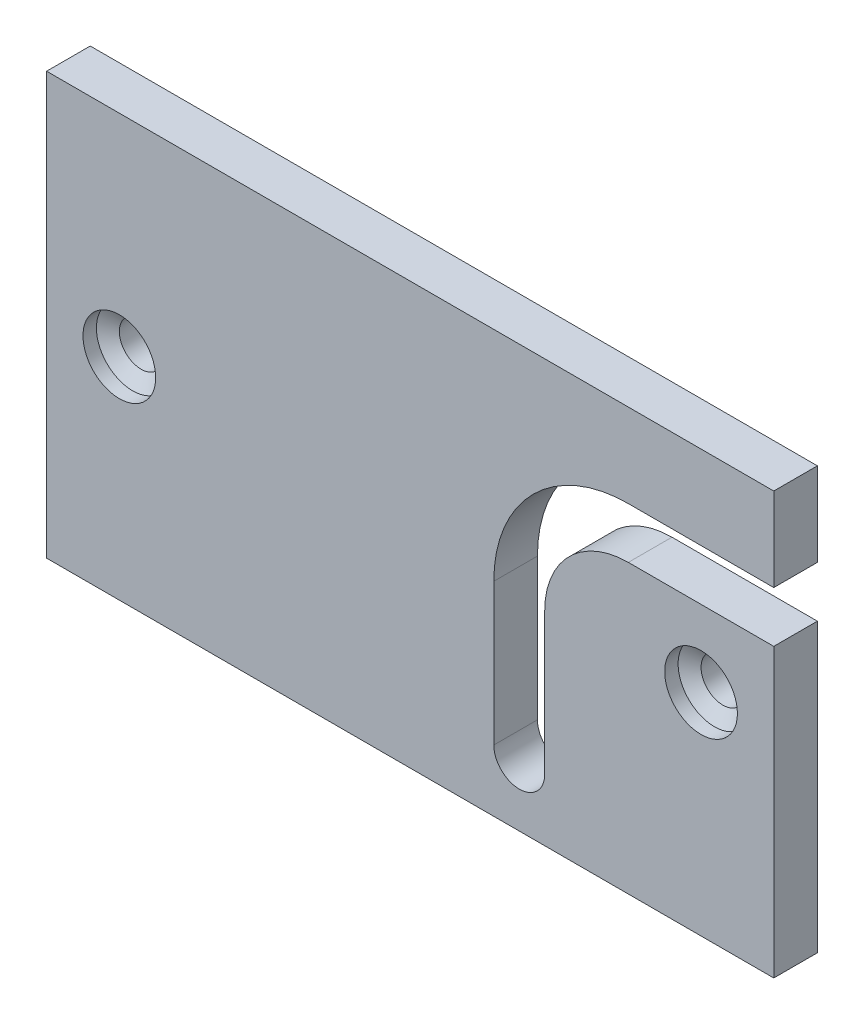
ISO-10303-21;
HEADER;
FILE_DESCRIPTION(('STEP AP214'),'2;1');
FILE_NAME('part.step','',(''),(''),'','','');
FILE_SCHEMA(('AUTOMOTIVE_DESIGN { 1 0 10303 214 1 1 1 1 }'));
ENDSEC;
DATA;
#1=APPLICATION_CONTEXT('core data for automotive mechanical design processes');
#2=APPLICATION_PROTOCOL_DEFINITION('international standard','automotive_design',2000,#1);
#3=PRODUCT_CONTEXT('',#1,'mechanical');
#4=PRODUCT('Part','Part','',(#3));
#5=PRODUCT_RELATED_PRODUCT_CATEGORY('part','',(#4));
#6=PRODUCT_DEFINITION_FORMATION('','',#4);
#7=PRODUCT_DEFINITION_CONTEXT('part definition',#1,'design');
#8=PRODUCT_DEFINITION('design','',#6,#7);
#9=PRODUCT_DEFINITION_SHAPE('','',#8);
#10=(LENGTH_UNIT() NAMED_UNIT(*) SI_UNIT(.MILLI.,.METRE.));
#11=(NAMED_UNIT(*) PLANE_ANGLE_UNIT() SI_UNIT($,.RADIAN.));
#12=(NAMED_UNIT(*) SI_UNIT($,.STERADIAN.) SOLID_ANGLE_UNIT());
#13=UNCERTAINTY_MEASURE_WITH_UNIT(LENGTH_MEASURE(1.E-05),#10,'distance_accuracy_value','');
#14=(GEOMETRIC_REPRESENTATION_CONTEXT(3) GLOBAL_UNCERTAINTY_ASSIGNED_CONTEXT((#13)) GLOBAL_UNIT_ASSIGNED_CONTEXT((#10,
#11,#12)) REPRESENTATION_CONTEXT('',''));
#15=CARTESIAN_POINT('',(0.,0.,0.));
#16=DIRECTION('',(0.,0.,1.));
#17=DIRECTION('',(1.,0.,0.));
#18=AXIS2_PLACEMENT_3D('',#15,#16,#17);
#19=CARTESIAN_POINT('',(50.,-29.,3.));
#20=DIRECTION('',(-1.,0.,0.));
#21=DIRECTION('',(0.,0.,1.));
#22=AXIS2_PLACEMENT_3D('',#19,#20,#21);
#23=PLANE('',#22);
#24=DIRECTION('',(0.,0.,1.));
#25=VECTOR('',#24,1.);
#26=CARTESIAN_POINT('',(50.,17.5,-3.));
#27=LINE('',#26,#25);
#28=CARTESIAN_POINT('',(50.,17.5,-3.));
#29=VERTEX_POINT('',#28);
#30=CARTESIAN_POINT('',(50.,17.5,3.));
#31=VERTEX_POINT('',#30);
#32=EDGE_CURVE('E219',#29,#31,#27,.T.);
#33=ORIENTED_EDGE('',*,*,#32,.F.);
#34=DIRECTION('',(0.,1.,0.));
#35=VECTOR('',#34,1.);
#36=CARTESIAN_POINT('',(50.,-29.,-3.));
#37=LINE('',#36,#35);
#38=CARTESIAN_POINT('',(50.,29.,-3.));
#39=VERTEX_POINT('',#38);
#40=EDGE_CURVE('E266',#29,#39,#37,.T.);
#41=ORIENTED_EDGE('',*,*,#40,.T.);
#42=DIRECTION('',(0.,0.,-1.));
#43=VECTOR('',#42,1.);
#44=CARTESIAN_POINT('',(50.,29.,3.));
#45=LINE('',#44,#43);
#46=CARTESIAN_POINT('',(50.,29.,3.));
#47=VERTEX_POINT('',#46);
#48=EDGE_CURVE('E275',#47,#39,#45,.T.);
#49=ORIENTED_EDGE('',*,*,#48,.F.);
#50=DIRECTION('',(0.,1.,0.));
#51=VECTOR('',#50,1.);
#52=CARTESIAN_POINT('',(50.,-29.,3.));
#53=LINE('',#52,#51);
#54=EDGE_CURVE('E252',#31,#47,#53,.T.);
#55=ORIENTED_EDGE('',*,*,#54,.F.);
#56=EDGE_LOOP('',(#33,#41,#49,#55));
#57=FACE_BOUND('',#56,.T.);
#58=ADVANCED_FACE('F42',(#57),#23,.F.);
#59=CARTESIAN_POINT('',(0.,0.,3.));
#60=DIRECTION('',(0.,0.,-1.));
#61=DIRECTION('',(-1.,0.,0.));
#62=AXIS2_PLACEMENT_3D('',#59,#60,#61);
#63=PLANE('',#62);
#64=CARTESIAN_POINT('',(40.,0.,3.));
#65=DIRECTION('',(0.,0.,1.));
#66=DIRECTION('',(1.,0.,0.));
#67=AXIS2_PLACEMENT_3D('',#64,#65,#66);
#68=CIRCLE('',#67,5.);
#69=CARTESIAN_POINT('',(45.,0.,3.));
#70=VERTEX_POINT('',#69);
#71=EDGE_CURVE('E212',#70,#70,#68,.T.);
#72=ORIENTED_EDGE('',*,*,#71,.F.);
#73=EDGE_LOOP('',(#72));
#74=FACE_BOUND('',#73,.T.);
#75=CARTESIAN_POINT('',(-40.,0.,3.));
#76=DIRECTION('',(0.,0.,1.));
#77=DIRECTION('',(1.,0.,0.));
#78=AXIS2_PLACEMENT_3D('',#75,#76,#77);
#79=CIRCLE('',#78,5.);
#80=CARTESIAN_POINT('',(-35.,0.,3.));
#81=VERTEX_POINT('',#80);
#82=EDGE_CURVE('E231',#81,#81,#79,.T.);
#83=ORIENTED_EDGE('',*,*,#82,.F.);
#84=EDGE_LOOP('',(#83));
#85=FACE_BOUND('',#84,.T.);
#86=DIRECTION('',(1.,0.,0.));
#87=VECTOR('',#86,1.);
#88=CARTESIAN_POINT('',(0.,17.5,3.));
#89=LINE('',#88,#87);
#90=CARTESIAN_POINT('',(30.,17.5,3.));
#91=VERTEX_POINT('',#90);
#92=EDGE_CURVE('E202',#91,#31,#89,.T.);
#93=ORIENTED_EDGE('',*,*,#92,.T.);
#94=ORIENTED_EDGE('',*,*,#54,.T.);
#95=DIRECTION('',(-1.,0.,0.));
#96=VECTOR('',#95,1.);
#97=CARTESIAN_POINT('',(-50.,29.,3.));
#98=LINE('',#97,#96);
#99=CARTESIAN_POINT('',(-50.,29.,3.));
#100=VERTEX_POINT('',#99);
#101=EDGE_CURVE('E68',#47,#100,#98,.T.);
#102=ORIENTED_EDGE('',*,*,#101,.T.);
#103=DIRECTION('',(0.,-1.,0.));
#104=VECTOR('',#103,1.);
#105=CARTESIAN_POINT('',(-50.,-29.,3.));
#106=LINE('',#105,#104);
#107=CARTESIAN_POINT('',(-50.,-29.,3.));
#108=VERTEX_POINT('',#107);
#109=EDGE_CURVE('E247',#100,#108,#106,.T.);
#110=ORIENTED_EDGE('',*,*,#109,.T.);
#111=DIRECTION('',(1.,0.,0.));
#112=VECTOR('',#111,1.);
#113=CARTESIAN_POINT('',(-50.,-29.,3.));
#114=LINE('',#113,#112);
#115=CARTESIAN_POINT('',(50.,-29.,3.));
#116=VERTEX_POINT('',#115);
#117=EDGE_CURVE('E97',#108,#116,#114,.T.);
#118=ORIENTED_EDGE('',*,*,#117,.T.);
#119=CARTESIAN_POINT('',(50.,10.5,3.));
#120=VERTEX_POINT('',#119);
#121=EDGE_CURVE('E253',#116,#120,#53,.T.);
#122=ORIENTED_EDGE('',*,*,#121,.T.);
#123=DIRECTION('',(1.,0.,0.));
#124=VECTOR('',#123,1.);
#125=CARTESIAN_POINT('',(0.,10.5,3.));
#126=LINE('',#125,#124);
#127=CARTESIAN_POINT('',(30.,10.5,3.));
#128=VERTEX_POINT('',#127);
#129=EDGE_CURVE('E199',#128,#120,#126,.T.);
#130=ORIENTED_EDGE('',*,*,#129,.F.);
#131=CARTESIAN_POINT('',(30.,-1.00000000000001,3.));
#132=DIRECTION('',(0.,0.,1.));
#133=DIRECTION('',(1.,0.,0.));
#134=AXIS2_PLACEMENT_3D('',#131,#132,#133);
#135=CIRCLE('',#134,11.5);
#136=CARTESIAN_POINT('',(18.5,-1.00000000000001,3.));
#137=VERTEX_POINT('',#136);
#138=EDGE_CURVE('E195',#137,#128,#135,.F.);
#139=ORIENTED_EDGE('',*,*,#138,.F.);
#140=DIRECTION('',(0.,1.,0.));
#141=VECTOR('',#140,1.);
#142=CARTESIAN_POINT('',(18.5,0.,3.));
#143=LINE('',#142,#141);
#144=CARTESIAN_POINT('',(18.5,-20.5,3.));
#145=VERTEX_POINT('',#144);
#146=EDGE_CURVE('E192',#145,#137,#143,.T.);
#147=ORIENTED_EDGE('',*,*,#146,.F.);
#148=CARTESIAN_POINT('',(15.,-20.5,3.));
#149=DIRECTION('',(0.,0.,1.));
#150=DIRECTION('',(1.,0.,0.));
#151=AXIS2_PLACEMENT_3D('',#148,#149,#150);
#152=CIRCLE('',#151,3.5);
#153=CARTESIAN_POINT('',(11.5,-20.5,3.));
#154=VERTEX_POINT('',#153);
#155=EDGE_CURVE('E150',#145,#154,#152,.F.);
#156=ORIENTED_EDGE('',*,*,#155,.T.);
#157=DIRECTION('',(0.,1.,0.));
#158=VECTOR('',#157,1.);
#159=CARTESIAN_POINT('',(11.5,0.,3.));
#160=LINE('',#159,#158);
#161=CARTESIAN_POINT('',(11.5,-1.00000000000001,3.));
#162=VERTEX_POINT('',#161);
#163=EDGE_CURVE('E169',#154,#162,#160,.T.);
#164=ORIENTED_EDGE('',*,*,#163,.T.);
#165=CARTESIAN_POINT('',(30.,-1.00000000000001,3.));
#166=DIRECTION('',(0.,0.,1.));
#167=DIRECTION('',(1.,0.,0.));
#168=AXIS2_PLACEMENT_3D('',#165,#166,#167);
#169=CIRCLE('',#168,18.5);
#170=EDGE_CURVE('E173',#162,#91,#169,.F.);
#171=ORIENTED_EDGE('',*,*,#170,.T.);
#172=EDGE_LOOP('',(#93,#94,#102,#110,#118,#122,#130,#139,#147,#156,#164,#171));
#173=FACE_BOUND('',#172,.T.);
#174=ADVANCED_FACE('F313',(#74,#85,#173),#63,.F.);
#175=CARTESIAN_POINT('',(0.,0.,-3.));
#176=DIRECTION('',(0.,0.,-1.));
#177=DIRECTION('',(-1.,0.,0.));
#178=AXIS2_PLACEMENT_3D('',#175,#176,#177);
#179=PLANE('',#178);
#180=CARTESIAN_POINT('',(-40.,0.,-3.));
#181=DIRECTION('',(0.,0.,1.));
#182=DIRECTION('',(1.,0.,0.));
#183=AXIS2_PLACEMENT_3D('',#180,#181,#182);
#184=CIRCLE('',#183,3.);
#185=CARTESIAN_POINT('',(-37.,0.,-3.));
#186=VERTEX_POINT('',#185);
#187=EDGE_CURVE('E239',#186,#186,#184,.T.);
#188=ORIENTED_EDGE('',*,*,#187,.T.);
#189=EDGE_LOOP('',(#188));
#190=FACE_BOUND('',#189,.T.);
#191=CARTESIAN_POINT('',(40.,0.,-3.));
#192=DIRECTION('',(0.,0.,1.));
#193=DIRECTION('',(1.,0.,0.));
#194=AXIS2_PLACEMENT_3D('',#191,#192,#193);
#195=CIRCLE('',#194,3.);
#196=CARTESIAN_POINT('',(43.,0.,-3.));
#197=VERTEX_POINT('',#196);
#198=EDGE_CURVE('E235',#197,#197,#195,.T.);
#199=ORIENTED_EDGE('',*,*,#198,.T.);
#200=EDGE_LOOP('',(#199));
#201=FACE_BOUND('',#200,.T.);
#202=ORIENTED_EDGE('',*,*,#40,.F.);
#203=DIRECTION('',(1.,0.,0.));
#204=VECTOR('',#203,1.);
#205=CARTESIAN_POINT('',(0.,17.5,-3.));
#206=LINE('',#205,#204);
#207=CARTESIAN_POINT('',(30.,17.5,-3.));
#208=VERTEX_POINT('',#207);
#209=EDGE_CURVE('E182',#208,#29,#206,.T.);
#210=ORIENTED_EDGE('',*,*,#209,.F.);
#211=CARTESIAN_POINT('',(30.,-1.00000000000001,-3.));
#212=DIRECTION('',(0.,0.,1.));
#213=DIRECTION('',(1.,0.,0.));
#214=AXIS2_PLACEMENT_3D('',#211,#212,#213);
#215=CIRCLE('',#214,18.5);
#216=CARTESIAN_POINT('',(11.5,-1.00000000000001,-3.));
#217=VERTEX_POINT('',#216);
#218=EDGE_CURVE('E185',#217,#208,#215,.F.);
#219=ORIENTED_EDGE('',*,*,#218,.F.);
#220=DIRECTION('',(0.,1.,0.));
#221=VECTOR('',#220,1.);
#222=CARTESIAN_POINT('',(11.5,0.,-3.));
#223=LINE('',#222,#221);
#224=CARTESIAN_POINT('',(11.5,-20.5,-3.));
#225=VERTEX_POINT('',#224);
#226=EDGE_CURVE('E156',#225,#217,#223,.T.);
#227=ORIENTED_EDGE('',*,*,#226,.F.);
#228=CARTESIAN_POINT('',(15.,-20.5,-3.));
#229=DIRECTION('',(0.,0.,1.));
#230=DIRECTION('',(1.,0.,0.));
#231=AXIS2_PLACEMENT_3D('',#228,#229,#230);
#232=CIRCLE('',#231,3.5);
#233=CARTESIAN_POINT('',(18.5,-20.5,-3.));
#234=VERTEX_POINT('',#233);
#235=EDGE_CURVE('E147',#234,#225,#232,.F.);
#236=ORIENTED_EDGE('',*,*,#235,.F.);
#237=DIRECTION('',(0.,1.,0.));
#238=VECTOR('',#237,1.);
#239=CARTESIAN_POINT('',(18.5,0.,-3.));
#240=LINE('',#239,#238);
#241=CARTESIAN_POINT('',(18.5,-1.00000000000001,-3.));
#242=VERTEX_POINT('',#241);
#243=EDGE_CURVE('E159',#234,#242,#240,.T.);
#244=ORIENTED_EDGE('',*,*,#243,.T.);
#245=CARTESIAN_POINT('',(30.,-1.00000000000001,-3.));
#246=DIRECTION('',(0.,0.,1.));
#247=DIRECTION('',(1.,0.,0.));
#248=AXIS2_PLACEMENT_3D('',#245,#246,#247);
#249=CIRCLE('',#248,11.5);
#250=CARTESIAN_POINT('',(30.,10.5,-3.));
#251=VERTEX_POINT('',#250);
#252=EDGE_CURVE('E59',#242,#251,#249,.F.);
#253=ORIENTED_EDGE('',*,*,#252,.T.);
#254=DIRECTION('',(1.,0.,0.));
#255=VECTOR('',#254,1.);
#256=CARTESIAN_POINT('',(0.,10.5,-3.));
#257=LINE('',#256,#255);
#258=CARTESIAN_POINT('',(50.,10.5,-3.));
#259=VERTEX_POINT('',#258);
#260=EDGE_CURVE('E178',#251,#259,#257,.T.);
#261=ORIENTED_EDGE('',*,*,#260,.T.);
#262=CARTESIAN_POINT('',(50.,-29.,-3.));
#263=VERTEX_POINT('',#262);
#264=EDGE_CURVE('E267',#263,#259,#37,.T.);
#265=ORIENTED_EDGE('',*,*,#264,.F.);
#266=DIRECTION('',(1.,0.,0.));
#267=VECTOR('',#266,1.);
#268=CARTESIAN_POINT('',(-50.,-29.,-3.));
#269=LINE('',#268,#267);
#270=CARTESIAN_POINT('',(-50.,-29.,-3.));
#271=VERTEX_POINT('',#270);
#272=EDGE_CURVE('E263',#271,#263,#269,.T.);
#273=ORIENTED_EDGE('',*,*,#272,.F.);
#274=DIRECTION('',(0.,-1.,0.));
#275=VECTOR('',#274,1.);
#276=CARTESIAN_POINT('',(-50.,-29.,-3.));
#277=LINE('',#276,#275);
#278=CARTESIAN_POINT('',(-50.,29.,-3.));
#279=VERTEX_POINT('',#278);
#280=EDGE_CURVE('E243',#279,#271,#277,.T.);
#281=ORIENTED_EDGE('',*,*,#280,.F.);
#282=DIRECTION('',(-1.,0.,0.));
#283=VECTOR('',#282,1.);
#284=CARTESIAN_POINT('',(-50.,29.,-3.));
#285=LINE('',#284,#283);
#286=EDGE_CURVE('E89',#39,#279,#285,.T.);
#287=ORIENTED_EDGE('',*,*,#286,.F.);
#288=EDGE_LOOP('',(#202,#210,#219,#227,#236,#244,#253,#261,#265,#273,#281,#287));
#289=FACE_BOUND('',#288,.T.);
#290=ADVANCED_FACE('F166',(#190,#201,#289),#179,.T.);
#291=CARTESIAN_POINT('',(40.,0.,-3.));
#292=DIRECTION('',(0.,0.,1.));
#293=DIRECTION('',(1.,0.,0.));
#294=AXIS2_PLACEMENT_3D('',#291,#292,#293);
#295=CYLINDRICAL_SURFACE('',#294,3.);
#296=CARTESIAN_POINT('',(40.,0.,0.));
#297=DIRECTION('',(0.,0.,1.));
#298=DIRECTION('',(1.,0.,0.));
#299=AXIS2_PLACEMENT_3D('',#296,#297,#298);
#300=CIRCLE('',#299,3.);
#301=CARTESIAN_POINT('',(43.,0.,0.));
#302=VERTEX_POINT('',#301);
#303=EDGE_CURVE('E285',#302,#302,#300,.T.);
#304=ORIENTED_EDGE('',*,*,#303,.T.);
#305=EDGE_LOOP('',(#304));
#306=FACE_BOUND('',#305,.T.);
#307=ORIENTED_EDGE('',*,*,#198,.F.);
#308=EDGE_LOOP('',(#307));
#309=FACE_BOUND('',#308,.T.);
#310=ADVANCED_FACE('F384',(#306,#309),#295,.F.);
#311=CARTESIAN_POINT('',(-40.,0.,-3.));
#312=DIRECTION('',(0.,0.,1.));
#313=DIRECTION('',(1.,0.,0.));
#314=AXIS2_PLACEMENT_3D('',#311,#312,#313);
#315=CYLINDRICAL_SURFACE('',#314,3.);
#316=CARTESIAN_POINT('',(-40.,0.,0.));
#317=DIRECTION('',(0.,0.,1.));
#318=DIRECTION('',(1.,0.,0.));
#319=AXIS2_PLACEMENT_3D('',#316,#317,#318);
#320=CIRCLE('',#319,3.);
#321=CARTESIAN_POINT('',(-37.,0.,0.));
#322=VERTEX_POINT('',#321);
#323=EDGE_CURVE('E289',#322,#322,#320,.T.);
#324=ORIENTED_EDGE('',*,*,#323,.T.);
#325=EDGE_LOOP('',(#324));
#326=FACE_BOUND('',#325,.T.);
#327=ORIENTED_EDGE('',*,*,#187,.F.);
#328=EDGE_LOOP('',(#327));
#329=FACE_BOUND('',#328,.T.);
#330=ADVANCED_FACE('F381',(#326,#329),#315,.F.);
#331=CARTESIAN_POINT('',(-50.,-29.,3.));
#332=DIRECTION('',(1.,0.,0.));
#333=DIRECTION('',(0.,1.,0.));
#334=AXIS2_PLACEMENT_3D('',#331,#332,#333);
#335=PLANE('',#334);
#336=ORIENTED_EDGE('',*,*,#280,.T.);
#337=DIRECTION('',(0.,0.,-1.));
#338=VECTOR('',#337,1.);
#339=CARTESIAN_POINT('',(-50.,-29.,3.));
#340=LINE('',#339,#338);
#341=EDGE_CURVE('E282',#108,#271,#340,.T.);
#342=ORIENTED_EDGE('',*,*,#341,.F.);
#343=ORIENTED_EDGE('',*,*,#109,.F.);
#344=DIRECTION('',(0.,0.,-1.));
#345=VECTOR('',#344,1.);
#346=CARTESIAN_POINT('',(-50.,29.,3.));
#347=LINE('',#346,#345);
#348=EDGE_CURVE('E259',#100,#279,#347,.T.);
#349=ORIENTED_EDGE('',*,*,#348,.T.);
#350=EDGE_LOOP('',(#336,#342,#343,#349));
#351=FACE_BOUND('',#350,.T.);
#352=ADVANCED_FACE('F333',(#351),#335,.F.);
#353=CARTESIAN_POINT('',(-50.,-29.,3.));
#354=DIRECTION('',(0.,1.,0.));
#355=DIRECTION('',(-1.,0.,0.));
#356=AXIS2_PLACEMENT_3D('',#353,#354,#355);
#357=PLANE('',#356);
#358=ORIENTED_EDGE('',*,*,#272,.T.);
#359=DIRECTION('',(0.,0.,-1.));
#360=VECTOR('',#359,1.);
#361=CARTESIAN_POINT('',(50.,-29.,3.));
#362=LINE('',#361,#360);
#363=EDGE_CURVE('E278',#116,#263,#362,.T.);
#364=ORIENTED_EDGE('',*,*,#363,.F.);
#365=ORIENTED_EDGE('',*,*,#117,.F.);
#366=ORIENTED_EDGE('',*,*,#341,.T.);
#367=EDGE_LOOP('',(#358,#364,#365,#366));
#368=FACE_BOUND('',#367,.T.);
#369=ADVANCED_FACE('F327',(#368),#357,.F.);
#370=ORIENTED_EDGE('',*,*,#264,.T.);
#371=DIRECTION('',(0.,0.,1.));
#372=VECTOR('',#371,1.);
#373=CARTESIAN_POINT('',(50.,10.5,-3.));
#374=LINE('',#373,#372);
#375=EDGE_CURVE('E222',#259,#120,#374,.T.);
#376=ORIENTED_EDGE('',*,*,#375,.T.);
#377=ORIENTED_EDGE('',*,*,#121,.F.);
#378=ORIENTED_EDGE('',*,*,#363,.T.);
#379=EDGE_LOOP('',(#370,#376,#377,#378));
#380=FACE_BOUND('',#379,.T.);
#381=ADVANCED_FACE('F316',(#380),#23,.F.);
#382=CARTESIAN_POINT('',(-50.,29.,3.));
#383=DIRECTION('',(0.,-1.,0.));
#384=DIRECTION('',(1.,0.,0.));
#385=AXIS2_PLACEMENT_3D('',#382,#383,#384);
#386=PLANE('',#385);
#387=ORIENTED_EDGE('',*,*,#286,.T.);
#388=ORIENTED_EDGE('',*,*,#348,.F.);
#389=ORIENTED_EDGE('',*,*,#101,.F.);
#390=ORIENTED_EDGE('',*,*,#48,.T.);
#391=EDGE_LOOP('',(#387,#388,#389,#390));
#392=FACE_BOUND('',#391,.T.);
#393=ADVANCED_FACE('F326',(#392),#386,.F.);
#394=CARTESIAN_POINT('',(-40.,0.,1.5));
#395=DIRECTION('',(0.,0.,1.));
#396=DIRECTION('',(1.,0.,0.));
#397=AXIS2_PLACEMENT_3D('',#394,#395,#396);
#398=CYLINDRICAL_SURFACE('',#397,5.);
#399=CARTESIAN_POINT('',(-40.,0.,1.15470053837922));
#400=DIRECTION('',(0.,0.,1.));
#401=DIRECTION('',(1.,0.,0.));
#402=AXIS2_PLACEMENT_3D('',#399,#400,#401);
#403=CIRCLE('',#402,5.);
#404=CARTESIAN_POINT('',(-35.,0.,1.15470053837922));
#405=VERTEX_POINT('',#404);
#406=EDGE_CURVE('E11',#405,#405,#403,.F.);
#407=ORIENTED_EDGE('',*,*,#406,.T.);
#408=EDGE_LOOP('',(#407));
#409=FACE_BOUND('',#408,.T.);
#410=ORIENTED_EDGE('',*,*,#82,.T.);
#411=EDGE_LOOP('',(#410));
#412=FACE_BOUND('',#411,.T.);
#413=ADVANCED_FACE('F307',(#409,#412),#398,.F.);
#414=CARTESIAN_POINT('',(40.,0.,1.5));
#415=DIRECTION('',(0.,0.,1.));
#416=DIRECTION('',(1.,0.,0.));
#417=AXIS2_PLACEMENT_3D('',#414,#415,#416);
#418=CYLINDRICAL_SURFACE('',#417,5.);
#419=CARTESIAN_POINT('',(40.,0.,1.15470053837922));
#420=DIRECTION('',(0.,0.,1.));
#421=DIRECTION('',(1.,0.,0.));
#422=AXIS2_PLACEMENT_3D('',#419,#420,#421);
#423=CIRCLE('',#422,5.);
#424=CARTESIAN_POINT('',(45.,0.,1.15470053837922));
#425=VERTEX_POINT('',#424);
#426=EDGE_CURVE('E52',#425,#425,#423,.F.);
#427=ORIENTED_EDGE('',*,*,#426,.T.);
#428=EDGE_LOOP('',(#427));
#429=FACE_BOUND('',#428,.T.);
#430=ORIENTED_EDGE('',*,*,#71,.T.);
#431=EDGE_LOOP('',(#430));
#432=FACE_BOUND('',#431,.T.);
#433=ADVANCED_FACE('F296',(#429,#432),#418,.F.);
#434=CARTESIAN_POINT('',(40.,0.,1.5));
#435=DIRECTION('',(0.,0.,1.));
#436=DIRECTION('',(1.,0.,0.));
#437=AXIS2_PLACEMENT_3D('',#434,#435,#436);
#438=CONICAL_SURFACE('',#437,5.59807621135337,1.0471975511966);
#439=ORIENTED_EDGE('',*,*,#303,.F.);
#440=EDGE_LOOP('',(#439));
#441=FACE_BOUND('',#440,.T.);
#442=ORIENTED_EDGE('',*,*,#426,.F.);
#443=EDGE_LOOP('',(#442));
#444=FACE_BOUND('',#443,.T.);
#445=ADVANCED_FACE('F299',(#441,#444),#438,.F.);
#446=CARTESIAN_POINT('',(-40.,0.,1.5));
#447=DIRECTION('',(0.,0.,1.));
#448=DIRECTION('',(1.,0.,0.));
#449=AXIS2_PLACEMENT_3D('',#446,#447,#448);
#450=CONICAL_SURFACE('',#449,5.59807621135337,1.0471975511966);
#451=ORIENTED_EDGE('',*,*,#323,.F.);
#452=EDGE_LOOP('',(#451));
#453=FACE_BOUND('',#452,.T.);
#454=ORIENTED_EDGE('',*,*,#406,.F.);
#455=EDGE_LOOP('',(#454));
#456=FACE_BOUND('',#455,.T.);
#457=ADVANCED_FACE('F45',(#453,#456),#450,.F.);
#458=CARTESIAN_POINT('',(15.,-20.5,-3.));
#459=DIRECTION('',(0.,0.,1.));
#460=DIRECTION('',(1.,0.,0.));
#461=AXIS2_PLACEMENT_3D('',#458,#459,#460);
#462=CYLINDRICAL_SURFACE('',#461,3.5);
#463=ORIENTED_EDGE('',*,*,#155,.F.);
#464=DIRECTION('',(0.,0.,1.));
#465=VECTOR('',#464,1.);
#466=CARTESIAN_POINT('',(18.5,-20.5,-3.));
#467=LINE('',#466,#465);
#468=EDGE_CURVE('E142',#234,#145,#467,.T.);
#469=ORIENTED_EDGE('',*,*,#468,.F.);
#470=ORIENTED_EDGE('',*,*,#235,.T.);
#471=DIRECTION('',(0.,0.,1.));
#472=VECTOR('',#471,1.);
#473=CARTESIAN_POINT('',(11.5,-20.5,-3.));
#474=LINE('',#473,#472);
#475=EDGE_CURVE('E209',#225,#154,#474,.T.);
#476=ORIENTED_EDGE('',*,*,#475,.T.);
#477=EDGE_LOOP('',(#463,#469,#470,#476));
#478=FACE_BOUND('',#477,.T.);
#479=ADVANCED_FACE('F144',(#478),#462,.F.);
#480=CARTESIAN_POINT('',(11.5,0.,-3.));
#481=DIRECTION('',(1.,0.,0.));
#482=DIRECTION('',(0.,0.,-1.));
#483=AXIS2_PLACEMENT_3D('',#480,#481,#482);
#484=PLANE('',#483);
#485=ORIENTED_EDGE('',*,*,#163,.F.);
#486=ORIENTED_EDGE('',*,*,#475,.F.);
#487=ORIENTED_EDGE('',*,*,#226,.T.);
#488=DIRECTION('',(0.,0.,1.));
#489=VECTOR('',#488,1.);
#490=CARTESIAN_POINT('',(11.5,-1.00000000000001,-3.));
#491=LINE('',#490,#489);
#492=EDGE_CURVE('E213',#217,#162,#491,.T.);
#493=ORIENTED_EDGE('',*,*,#492,.T.);
#494=EDGE_LOOP('',(#485,#486,#487,#493));
#495=FACE_BOUND('',#494,.T.);
#496=ADVANCED_FACE('F359',(#495),#484,.T.);
#497=CARTESIAN_POINT('',(30.,-1.00000000000001,-3.));
#498=DIRECTION('',(0.,0.,1.));
#499=DIRECTION('',(1.,0.,0.));
#500=AXIS2_PLACEMENT_3D('',#497,#498,#499);
#501=CYLINDRICAL_SURFACE('',#500,18.5);
#502=ORIENTED_EDGE('',*,*,#170,.F.);
#503=ORIENTED_EDGE('',*,*,#492,.F.);
#504=ORIENTED_EDGE('',*,*,#218,.T.);
#505=DIRECTION('',(0.,0.,1.));
#506=VECTOR('',#505,1.);
#507=CARTESIAN_POINT('',(30.,17.5,-3.));
#508=LINE('',#507,#506);
#509=EDGE_CURVE('E216',#208,#91,#508,.T.);
#510=ORIENTED_EDGE('',*,*,#509,.T.);
#511=EDGE_LOOP('',(#502,#503,#504,#510));
#512=FACE_BOUND('',#511,.T.);
#513=ADVANCED_FACE('F356',(#512),#501,.F.);
#514=CARTESIAN_POINT('',(0.,17.5,-3.));
#515=DIRECTION('',(0.,-1.,0.));
#516=DIRECTION('',(0.,0.,-1.));
#517=AXIS2_PLACEMENT_3D('',#514,#515,#516);
#518=PLANE('',#517);
#519=ORIENTED_EDGE('',*,*,#92,.F.);
#520=ORIENTED_EDGE('',*,*,#509,.F.);
#521=ORIENTED_EDGE('',*,*,#209,.T.);
#522=ORIENTED_EDGE('',*,*,#32,.T.);
#523=EDGE_LOOP('',(#519,#520,#521,#522));
#524=FACE_BOUND('',#523,.T.);
#525=ADVANCED_FACE('F352',(#524),#518,.T.);
#526=CARTESIAN_POINT('',(0.,10.5,-3.));
#527=DIRECTION('',(0.,-1.,0.));
#528=DIRECTION('',(0.,0.,-1.));
#529=AXIS2_PLACEMENT_3D('',#526,#527,#528);
#530=PLANE('',#529);
#531=ORIENTED_EDGE('',*,*,#129,.T.);
#532=ORIENTED_EDGE('',*,*,#375,.F.);
#533=ORIENTED_EDGE('',*,*,#260,.F.);
#534=DIRECTION('',(0.,0.,1.));
#535=VECTOR('',#534,1.);
#536=CARTESIAN_POINT('',(30.,10.5,-3.));
#537=LINE('',#536,#535);
#538=EDGE_CURVE('E226',#251,#128,#537,.T.);
#539=ORIENTED_EDGE('',*,*,#538,.T.);
#540=EDGE_LOOP('',(#531,#532,#533,#539));
#541=FACE_BOUND('',#540,.T.);
#542=ADVANCED_FACE('F339',(#541),#530,.F.);
#543=CARTESIAN_POINT('',(30.,-1.00000000000001,-3.));
#544=DIRECTION('',(0.,0.,1.));
#545=DIRECTION('',(1.,0.,0.));
#546=AXIS2_PLACEMENT_3D('',#543,#544,#545);
#547=CYLINDRICAL_SURFACE('',#546,11.5);
#548=ORIENTED_EDGE('',*,*,#138,.T.);
#549=ORIENTED_EDGE('',*,*,#538,.F.);
#550=ORIENTED_EDGE('',*,*,#252,.F.);
#551=DIRECTION('',(0.,0.,1.));
#552=VECTOR('',#551,1.);
#553=CARTESIAN_POINT('',(18.5,-1.00000000000001,-3.));
#554=LINE('',#553,#552);
#555=EDGE_CURVE('E155',#242,#137,#554,.T.);
#556=ORIENTED_EDGE('',*,*,#555,.T.);
#557=EDGE_LOOP('',(#548,#549,#550,#556));
#558=FACE_BOUND('',#557,.T.);
#559=ADVANCED_FACE('F373',(#558),#547,.T.);
#560=CARTESIAN_POINT('',(18.5,0.,-3.));
#561=DIRECTION('',(1.,0.,0.));
#562=DIRECTION('',(0.,0.,-1.));
#563=AXIS2_PLACEMENT_3D('',#560,#561,#562);
#564=PLANE('',#563);
#565=ORIENTED_EDGE('',*,*,#146,.T.);
#566=ORIENTED_EDGE('',*,*,#555,.F.);
#567=ORIENTED_EDGE('',*,*,#243,.F.);
#568=ORIENTED_EDGE('',*,*,#468,.T.);
#569=EDGE_LOOP('',(#565,#566,#567,#568));
#570=FACE_BOUND('',#569,.T.);
#571=ADVANCED_FACE('F160',(#570),#564,.F.);
#572=CLOSED_SHELL('',(#58,#174,#290,#310,#330,#352,#369,#381,#393,#413,#433,#445,#457,#479,#496,
#513,#525,#542,#559,#571));
#573=MANIFOLD_SOLID_BREP('B2',#572);
#574=ADVANCED_BREP_SHAPE_REPRESENTATION('',(#18,#573),#14);
#575=SHAPE_DEFINITION_REPRESENTATION(#9,#574);
ENDSEC;
END-ISO-10303-21;
